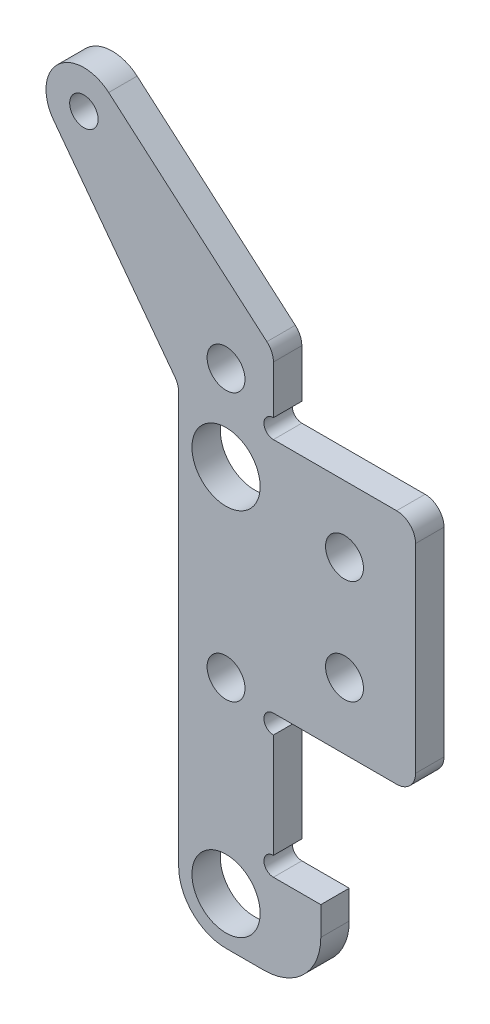
ISO-10303-21;
HEADER;
FILE_DESCRIPTION(('STEP AP214'),'2;1');
FILE_NAME('part.step','',(''),(''),'','','');
FILE_SCHEMA(('AUTOMOTIVE_DESIGN { 1 0 10303 214 1 1 1 1 }'));
ENDSEC;
DATA;
#1=APPLICATION_CONTEXT('core data for automotive mechanical design processes');
#2=APPLICATION_PROTOCOL_DEFINITION('international standard','automotive_design',2000,#1);
#3=PRODUCT_CONTEXT('',#1,'mechanical');
#4=PRODUCT('Part','Part','',(#3));
#5=PRODUCT_RELATED_PRODUCT_CATEGORY('part','',(#4));
#6=PRODUCT_DEFINITION_FORMATION('','',#4);
#7=PRODUCT_DEFINITION_CONTEXT('part definition',#1,'design');
#8=PRODUCT_DEFINITION('design','',#6,#7);
#9=PRODUCT_DEFINITION_SHAPE('','',#8);
#10=(LENGTH_UNIT() NAMED_UNIT(*) SI_UNIT(.MILLI.,.METRE.));
#11=(NAMED_UNIT(*) PLANE_ANGLE_UNIT() SI_UNIT($,.RADIAN.));
#12=(NAMED_UNIT(*) SI_UNIT($,.STERADIAN.) SOLID_ANGLE_UNIT());
#13=UNCERTAINTY_MEASURE_WITH_UNIT(LENGTH_MEASURE(1.E-05),#10,'distance_accuracy_value','');
#14=(GEOMETRIC_REPRESENTATION_CONTEXT(3) GLOBAL_UNCERTAINTY_ASSIGNED_CONTEXT((#13)) GLOBAL_UNIT_ASSIGNED_CONTEXT((#10,
#11,#12)) REPRESENTATION_CONTEXT('',''));
#15=CARTESIAN_POINT('',(0.,0.,0.));
#16=DIRECTION('',(0.,0.,1.));
#17=DIRECTION('',(1.,0.,0.));
#18=AXIS2_PLACEMENT_3D('',#15,#16,#17);
#19=CARTESIAN_POINT('',(-60.,0.,3.));
#20=DIRECTION('',(0.,0.,1.));
#21=DIRECTION('',(1.,0.,0.));
#22=AXIS2_PLACEMENT_3D('',#19,#20,#21);
#23=PLANE('',#22);
#24=DIRECTION('',(1.,0.,0.));
#25=VECTOR('',#24,1.);
#26=CARTESIAN_POINT('',(-60.,-5.00000000000001,3.));
#27=LINE('',#26,#25);
#28=CARTESIAN_POINT('',(-60.,-5.,3.));
#29=VERTEX_POINT('',#28);
#30=CARTESIAN_POINT('',(-56.,-5.00000000000001,3.));
#31=VERTEX_POINT('',#30);
#32=EDGE_CURVE('E391',#29,#31,#27,.T.);
#33=ORIENTED_EDGE('',*,*,#32,.T.);
#34=CARTESIAN_POINT('',(-56.,0.999999999999995,3.));
#35=DIRECTION('',(0.,0.,1.));
#36=DIRECTION('',(1.,0.,0.));
#37=AXIS2_PLACEMENT_3D('',#34,#35,#36);
#38=CIRCLE('',#37,6.);
#39=CARTESIAN_POINT('',(-50.,0.999999999999995,3.));
#40=VERTEX_POINT('',#39);
#41=EDGE_CURVE('E11',#31,#40,#38,.T.);
#42=ORIENTED_EDGE('',*,*,#41,.T.);
#43=DIRECTION('',(0.,1.,0.));
#44=VECTOR('',#43,1.);
#45=CARTESIAN_POINT('',(-50.,-5.,3.));
#46=LINE('',#45,#44);
#47=CARTESIAN_POINT('',(-50.,3.99999999999976,3.));
#48=VERTEX_POINT('',#47);
#49=EDGE_CURVE('E367',#40,#48,#46,.T.);
#50=ORIENTED_EDGE('',*,*,#49,.T.);
#51=DIRECTION('',(-1.,0.,0.));
#52=VECTOR('',#51,1.);
#53=CARTESIAN_POINT('',(-50.,3.99999999999976,3.));
#54=LINE('',#53,#52);
#55=CARTESIAN_POINT('',(-55.,3.99999999999976,3.));
#56=VERTEX_POINT('',#55);
#57=EDGE_CURVE('E381',#48,#56,#54,.T.);
#58=ORIENTED_EDGE('',*,*,#57,.T.);
#59=CARTESIAN_POINT('',(-55.,4.99999999999976,3.));
#60=DIRECTION('',(0.,0.,1.));
#61=DIRECTION('',(1.,0.,0.));
#62=AXIS2_PLACEMENT_3D('',#59,#60,#61);
#63=CIRCLE('',#62,0.999999999999998);
#64=CARTESIAN_POINT('',(-55.,5.99999999999976,3.));
#65=VERTEX_POINT('',#64);
#66=EDGE_CURVE('E428',#65,#56,#63,.T.);
#67=ORIENTED_EDGE('',*,*,#66,.F.);
#68=DIRECTION('',(0.,1.,0.));
#69=VECTOR('',#68,1.);
#70=CARTESIAN_POINT('',(-55.,18.9999999999998,3.));
#71=LINE('',#70,#69);
#72=CARTESIAN_POINT('',(-55.,16.9999999999998,3.));
#73=VERTEX_POINT('',#72);
#74=EDGE_CURVE('E384',#65,#73,#71,.T.);
#75=ORIENTED_EDGE('',*,*,#74,.T.);
#76=CARTESIAN_POINT('',(-55.,17.9999999999998,3.));
#77=DIRECTION('',(0.,0.,1.));
#78=DIRECTION('',(1.,0.,0.));
#79=AXIS2_PLACEMENT_3D('',#76,#77,#78);
#80=CIRCLE('',#79,0.999999999999998);
#81=CARTESIAN_POINT('',(-55.,18.9999999999998,3.));
#82=VERTEX_POINT('',#81);
#83=EDGE_CURVE('E423',#82,#73,#80,.T.);
#84=ORIENTED_EDGE('',*,*,#83,.F.);
#85=DIRECTION('',(1.,0.,0.));
#86=VECTOR('',#85,1.);
#87=CARTESIAN_POINT('',(-40.0000000000001,18.9999999999998,3.));
#88=LINE('',#87,#86);
#89=CARTESIAN_POINT('',(-42.0000000000001,18.9999999999998,3.));
#90=VERTEX_POINT('',#89);
#91=EDGE_CURVE('E389',#82,#90,#88,.T.);
#92=ORIENTED_EDGE('',*,*,#91,.T.);
#93=CARTESIAN_POINT('',(-42.0000000000001,20.9999999999998,3.));
#94=DIRECTION('',(0.,0.,1.));
#95=DIRECTION('',(1.,0.,0.));
#96=AXIS2_PLACEMENT_3D('',#93,#94,#95);
#97=CIRCLE('',#96,2.);
#98=CARTESIAN_POINT('',(-40.0000000000001,20.9999999999998,3.));
#99=VERTEX_POINT('',#98);
#100=EDGE_CURVE('E330',#90,#99,#97,.T.);
#101=ORIENTED_EDGE('',*,*,#100,.T.);
#102=DIRECTION('',(0.,1.,0.));
#103=VECTOR('',#102,1.);
#104=CARTESIAN_POINT('',(-40.0000000000001,43.9999999999998,3.));
#105=LINE('',#104,#103);
#106=CARTESIAN_POINT('',(-40.0000000000001,41.9999999999998,3.));
#107=VERTEX_POINT('',#106);
#108=EDGE_CURVE('E221',#99,#107,#105,.T.);
#109=ORIENTED_EDGE('',*,*,#108,.T.);
#110=CARTESIAN_POINT('',(-42.0000000000001,41.9999999999998,3.));
#111=DIRECTION('',(0.,0.,1.));
#112=DIRECTION('',(1.,0.,0.));
#113=AXIS2_PLACEMENT_3D('',#110,#111,#112);
#114=CIRCLE('',#113,2.);
#115=CARTESIAN_POINT('',(-42.0000000000001,43.9999999999998,3.));
#116=VERTEX_POINT('',#115);
#117=EDGE_CURVE('E327',#107,#116,#114,.T.);
#118=ORIENTED_EDGE('',*,*,#117,.T.);
#119=DIRECTION('',(-1.,0.,0.));
#120=VECTOR('',#119,1.);
#121=CARTESIAN_POINT('',(-55.,43.9999999999998,3.));
#122=LINE('',#121,#120);
#123=CARTESIAN_POINT('',(-55.,43.9999999999998,3.));
#124=VERTEX_POINT('',#123);
#125=EDGE_CURVE('E207',#116,#124,#122,.T.);
#126=ORIENTED_EDGE('',*,*,#125,.T.);
#127=CARTESIAN_POINT('',(-55.,44.9999999999998,3.));
#128=DIRECTION('',(0.,0.,1.));
#129=DIRECTION('',(1.,0.,0.));
#130=AXIS2_PLACEMENT_3D('',#127,#128,#129);
#131=CIRCLE('',#130,0.999999999999998);
#132=CARTESIAN_POINT('',(-55.,45.9999999999998,3.));
#133=VERTEX_POINT('',#132);
#134=EDGE_CURVE('E189',#133,#124,#131,.T.);
#135=ORIENTED_EDGE('',*,*,#134,.F.);
#136=DIRECTION('',(0.,1.,0.));
#137=VECTOR('',#136,1.);
#138=CARTESIAN_POINT('',(-55.,43.9999999999998,3.));
#139=LINE('',#138,#137);
#140=CARTESIAN_POINT('',(-55.,51.0851457844871,3.));
#141=VERTEX_POINT('',#140);
#142=EDGE_CURVE('E204',#133,#141,#139,.T.);
#143=ORIENTED_EDGE('',*,*,#142,.T.);
#144=CARTESIAN_POINT('',(-57.,51.0851457844871,3.));
#145=DIRECTION('',(0.,0.,1.));
#146=DIRECTION('',(1.,0.,0.));
#147=AXIS2_PLACEMENT_3D('',#144,#145,#146);
#148=CIRCLE('',#147,2.);
#149=CARTESIAN_POINT('',(-55.6921360035521,52.5982524452336,3.));
#150=VERTEX_POINT('',#149);
#151=EDGE_CURVE('E324',#141,#150,#148,.T.);
#152=ORIENTED_EDGE('',*,*,#151,.T.);
#153=DIRECTION('',(-0.756553330373234,0.65393199822395,0.));
#154=VECTOR('',#153,1.);
#155=CARTESIAN_POINT('',(-72.3842720071042,67.0262133214929,3.));
#156=LINE('',#155,#154);
#157=CARTESIAN_POINT('',(-72.3842720071042,67.0262133214929,3.));
#158=VERTEX_POINT('',#157);
#159=EDGE_CURVE('E215',#150,#158,#156,.T.);
#160=ORIENTED_EDGE('',*,*,#159,.T.);
#161=CARTESIAN_POINT('',(-75.,64.,3.));
#162=DIRECTION('',(0.,0.,1.));
#163=DIRECTION('',(1.,0.,0.));
#164=AXIS2_PLACEMENT_3D('',#161,#162,#163);
#165=CIRCLE('',#164,4.);
#166=CARTESIAN_POINT('',(-78.2,61.6,3.));
#167=VERTEX_POINT('',#166);
#168=EDGE_CURVE('E219',#158,#167,#165,.T.);
#169=ORIENTED_EDGE('',*,*,#168,.T.);
#170=DIRECTION('',(0.599999999999995,-0.800000000000004,0.));
#171=VECTOR('',#170,1.);
#172=CARTESIAN_POINT('',(-78.2,61.6,3.));
#173=LINE('',#172,#171);
#174=CARTESIAN_POINT('',(-65.4,44.5333333333331,3.));
#175=VERTEX_POINT('',#174);
#176=EDGE_CURVE('E273',#167,#175,#173,.T.);
#177=ORIENTED_EDGE('',*,*,#176,.T.);
#178=CARTESIAN_POINT('',(-67.,43.3333333333331,3.));
#179=DIRECTION('',(0.,0.,1.));
#180=DIRECTION('',(1.,0.,0.));
#181=AXIS2_PLACEMENT_3D('',#178,#179,#180);
#182=CIRCLE('',#181,2.);
#183=CARTESIAN_POINT('',(-65.,43.3333333333331,3.));
#184=VERTEX_POINT('',#183);
#185=EDGE_CURVE('E353',#175,#184,#182,.F.);
#186=ORIENTED_EDGE('',*,*,#185,.T.);
#187=DIRECTION('',(0.,-1.,0.));
#188=VECTOR('',#187,1.);
#189=CARTESIAN_POINT('',(-65.,0.,3.));
#190=LINE('',#189,#188);
#191=CARTESIAN_POINT('',(-65.,0.,3.));
#192=VERTEX_POINT('',#191);
#193=EDGE_CURVE('E488',#184,#192,#190,.T.);
#194=ORIENTED_EDGE('',*,*,#193,.T.);
#195=CARTESIAN_POINT('',(-60.,0.,3.));
#196=DIRECTION('',(0.,0.,1.));
#197=DIRECTION('',(1.,0.,0.));
#198=AXIS2_PLACEMENT_3D('',#195,#196,#197);
#199=CIRCLE('',#198,4.99999999999999);
#200=EDGE_CURVE('E491',#192,#29,#199,.T.);
#201=ORIENTED_EDGE('',*,*,#200,.T.);
#202=EDGE_LOOP('',(#33,#42,#50,#58,#67,#75,#84,#92,#101,#109,#118,#126,#135,#143,#152,#160,#169,
#177,#186,#194,#201));
#203=FACE_BOUND('',#202,.T.);
#204=CARTESIAN_POINT('',(-47.5000000000001,25.9999999999998,3.));
#205=DIRECTION('',(0.,0.,1.));
#206=DIRECTION('',(1.,0.,0.));
#207=AXIS2_PLACEMENT_3D('',#204,#205,#206);
#208=CIRCLE('',#207,2.);
#209=CARTESIAN_POINT('',(-45.5000000000001,25.9999999999998,3.));
#210=VERTEX_POINT('',#209);
#211=EDGE_CURVE('E439',#210,#210,#208,.T.);
#212=ORIENTED_EDGE('',*,*,#211,.F.);
#213=EDGE_LOOP('',(#212));
#214=FACE_BOUND('',#213,.T.);
#215=CARTESIAN_POINT('',(-60.,48.,3.));
#216=DIRECTION('',(0.,0.,1.));
#217=DIRECTION('',(1.,0.,0.));
#218=AXIS2_PLACEMENT_3D('',#215,#216,#217);
#219=CIRCLE('',#218,2.);
#220=CARTESIAN_POINT('',(-58.,48.,3.));
#221=VERTEX_POINT('',#220);
#222=EDGE_CURVE('E455',#221,#221,#219,.T.);
#223=ORIENTED_EDGE('',*,*,#222,.F.);
#224=EDGE_LOOP('',(#223));
#225=FACE_BOUND('',#224,.T.);
#226=CARTESIAN_POINT('',(-75.,64.,3.));
#227=DIRECTION('',(0.,0.,1.));
#228=DIRECTION('',(1.,0.,0.));
#229=AXIS2_PLACEMENT_3D('',#226,#227,#228);
#230=CIRCLE('',#229,1.5);
#231=CARTESIAN_POINT('',(-73.5,64.,3.));
#232=VERTEX_POINT('',#231);
#233=EDGE_CURVE('E471',#232,#232,#230,.T.);
#234=ORIENTED_EDGE('',*,*,#233,.F.);
#235=EDGE_LOOP('',(#234));
#236=FACE_BOUND('',#235,.T.);
#237=CARTESIAN_POINT('',(-60.,0.,3.));
#238=DIRECTION('',(0.,0.,1.));
#239=DIRECTION('',(1.,0.,0.));
#240=AXIS2_PLACEMENT_3D('',#237,#238,#239);
#241=CIRCLE('',#240,3.6);
#242=CARTESIAN_POINT('',(-56.4,0.,3.));
#243=VERTEX_POINT('',#242);
#244=EDGE_CURVE('E233',#243,#243,#241,.T.);
#245=ORIENTED_EDGE('',*,*,#244,.F.);
#246=EDGE_LOOP('',(#245));
#247=FACE_BOUND('',#246,.T.);
#248=CARTESIAN_POINT('',(-60.,39.,3.));
#249=DIRECTION('',(0.,0.,1.));
#250=DIRECTION('',(1.,0.,0.));
#251=AXIS2_PLACEMENT_3D('',#248,#249,#250);
#252=CIRCLE('',#251,3.6);
#253=CARTESIAN_POINT('',(-56.4,39.,3.));
#254=VERTEX_POINT('',#253);
#255=EDGE_CURVE('E463',#254,#254,#252,.T.);
#256=ORIENTED_EDGE('',*,*,#255,.F.);
#257=EDGE_LOOP('',(#256));
#258=FACE_BOUND('',#257,.T.);
#259=CARTESIAN_POINT('',(-60.,19.75,3.));
#260=DIRECTION('',(0.,0.,1.));
#261=DIRECTION('',(1.,0.,0.));
#262=AXIS2_PLACEMENT_3D('',#259,#260,#261);
#263=CIRCLE('',#262,2.);
#264=CARTESIAN_POINT('',(-58.,19.75,3.));
#265=VERTEX_POINT('',#264);
#266=EDGE_CURVE('E447',#265,#265,#263,.T.);
#267=ORIENTED_EDGE('',*,*,#266,.F.);
#268=EDGE_LOOP('',(#267));
#269=FACE_BOUND('',#268,.T.);
#270=CARTESIAN_POINT('',(-47.5000000000001,36.9999999999998,3.));
#271=DIRECTION('',(0.,0.,1.));
#272=DIRECTION('',(1.,0.,0.));
#273=AXIS2_PLACEMENT_3D('',#270,#271,#272);
#274=CIRCLE('',#273,2.);
#275=CARTESIAN_POINT('',(-45.5000000000001,36.9999999999998,3.));
#276=VERTEX_POINT('',#275);
#277=EDGE_CURVE('E431',#276,#276,#274,.T.);
#278=ORIENTED_EDGE('',*,*,#277,.F.);
#279=EDGE_LOOP('',(#278));
#280=FACE_BOUND('',#279,.T.);
#281=ADVANCED_FACE('F41',(#203,#214,#225,#236,#247,#258,#269,#280),#23,.T.);
#282=CARTESIAN_POINT('',(-60.,0.,0.));
#283=DIRECTION('',(0.,0.,1.));
#284=DIRECTION('',(1.,0.,0.));
#285=AXIS2_PLACEMENT_3D('',#282,#283,#284);
#286=PLANE('',#285);
#287=DIRECTION('',(0.,1.,0.));
#288=VECTOR('',#287,1.);
#289=CARTESIAN_POINT('',(-50.,-5.,0.));
#290=LINE('',#289,#288);
#291=CARTESIAN_POINT('',(-50.,0.999999999999995,0.));
#292=VERTEX_POINT('',#291);
#293=CARTESIAN_POINT('',(-50.,3.99999999999976,0.));
#294=VERTEX_POINT('',#293);
#295=EDGE_CURVE('E242',#292,#294,#290,.T.);
#296=ORIENTED_EDGE('',*,*,#295,.F.);
#297=CARTESIAN_POINT('',(-56.,0.999999999999995,0.));
#298=DIRECTION('',(0.,0.,1.));
#299=DIRECTION('',(1.,0.,0.));
#300=AXIS2_PLACEMENT_3D('',#297,#298,#299);
#301=CIRCLE('',#300,6.);
#302=CARTESIAN_POINT('',(-56.,-5.00000000000001,0.));
#303=VERTEX_POINT('',#302);
#304=EDGE_CURVE('E64',#292,#303,#301,.F.);
#305=ORIENTED_EDGE('',*,*,#304,.T.);
#306=DIRECTION('',(1.,0.,0.));
#307=VECTOR('',#306,1.);
#308=CARTESIAN_POINT('',(-60.,-5.00000000000001,0.));
#309=LINE('',#308,#307);
#310=CARTESIAN_POINT('',(-60.,-5.,0.));
#311=VERTEX_POINT('',#310);
#312=EDGE_CURVE('E239',#311,#303,#309,.T.);
#313=ORIENTED_EDGE('',*,*,#312,.F.);
#314=CARTESIAN_POINT('',(-60.,0.,0.));
#315=DIRECTION('',(0.,0.,1.));
#316=DIRECTION('',(1.,0.,0.));
#317=AXIS2_PLACEMENT_3D('',#314,#315,#316);
#318=CIRCLE('',#317,4.99999999999999);
#319=CARTESIAN_POINT('',(-65.,0.,0.));
#320=VERTEX_POINT('',#319);
#321=EDGE_CURVE('E236',#320,#311,#318,.T.);
#322=ORIENTED_EDGE('',*,*,#321,.F.);
#323=DIRECTION('',(0.,-1.,0.));
#324=VECTOR('',#323,1.);
#325=CARTESIAN_POINT('',(-65.,0.,0.));
#326=LINE('',#325,#324);
#327=CARTESIAN_POINT('',(-65.,43.3333333333331,0.));
#328=VERTEX_POINT('',#327);
#329=EDGE_CURVE('E232',#328,#320,#326,.T.);
#330=ORIENTED_EDGE('',*,*,#329,.F.);
#331=CARTESIAN_POINT('',(-67.,43.3333333333331,0.));
#332=DIRECTION('',(0.,0.,1.));
#333=DIRECTION('',(1.,0.,0.));
#334=AXIS2_PLACEMENT_3D('',#331,#332,#333);
#335=CIRCLE('',#334,2.);
#336=CARTESIAN_POINT('',(-65.4,44.5333333333331,0.));
#337=VERTEX_POINT('',#336);
#338=EDGE_CURVE('E350',#328,#337,#335,.T.);
#339=ORIENTED_EDGE('',*,*,#338,.T.);
#340=DIRECTION('',(0.599999999999995,-0.800000000000004,0.));
#341=VECTOR('',#340,1.);
#342=CARTESIAN_POINT('',(-78.2,61.6,0.));
#343=LINE('',#342,#341);
#344=CARTESIAN_POINT('',(-78.2,61.6,0.));
#345=VERTEX_POINT('',#344);
#346=EDGE_CURVE('E228',#345,#337,#343,.T.);
#347=ORIENTED_EDGE('',*,*,#346,.F.);
#348=CARTESIAN_POINT('',(-75.,64.,0.));
#349=DIRECTION('',(0.,0.,1.));
#350=DIRECTION('',(1.,0.,0.));
#351=AXIS2_PLACEMENT_3D('',#348,#349,#350);
#352=CIRCLE('',#351,4.);
#353=CARTESIAN_POINT('',(-72.3842720071042,67.0262133214929,0.));
#354=VERTEX_POINT('',#353);
#355=EDGE_CURVE('E270',#354,#345,#352,.T.);
#356=ORIENTED_EDGE('',*,*,#355,.F.);
#357=DIRECTION('',(-0.756553330373234,0.65393199822395,0.));
#358=VECTOR('',#357,1.);
#359=CARTESIAN_POINT('',(-72.3842720071042,67.0262133214929,0.));
#360=LINE('',#359,#358);
#361=CARTESIAN_POINT('',(-55.6921360035521,52.5982524452336,0.));
#362=VERTEX_POINT('',#361);
#363=EDGE_CURVE('E267',#362,#354,#360,.T.);
#364=ORIENTED_EDGE('',*,*,#363,.F.);
#365=CARTESIAN_POINT('',(-57.,51.0851457844871,0.));
#366=DIRECTION('',(0.,0.,1.));
#367=DIRECTION('',(1.,0.,0.));
#368=AXIS2_PLACEMENT_3D('',#365,#366,#367);
#369=CIRCLE('',#368,2.);
#370=CARTESIAN_POINT('',(-55.,51.0851457844871,0.));
#371=VERTEX_POINT('',#370);
#372=EDGE_CURVE('E312',#362,#371,#369,.F.);
#373=ORIENTED_EDGE('',*,*,#372,.T.);
#374=DIRECTION('',(0.,1.,0.));
#375=VECTOR('',#374,1.);
#376=CARTESIAN_POINT('',(-55.,43.9999999999998,0.));
#377=LINE('',#376,#375);
#378=CARTESIAN_POINT('',(-55.,45.9999999999998,0.));
#379=VERTEX_POINT('',#378);
#380=EDGE_CURVE('E264',#379,#371,#377,.T.);
#381=ORIENTED_EDGE('',*,*,#380,.F.);
#382=CARTESIAN_POINT('',(-55.,44.9999999999998,0.));
#383=DIRECTION('',(0.,0.,1.));
#384=DIRECTION('',(1.,0.,0.));
#385=AXIS2_PLACEMENT_3D('',#382,#383,#384);
#386=CIRCLE('',#385,0.999999999999998);
#387=CARTESIAN_POINT('',(-55.,43.9999999999998,0.));
#388=VERTEX_POINT('',#387);
#389=EDGE_CURVE('E192',#379,#388,#386,.T.);
#390=ORIENTED_EDGE('',*,*,#389,.T.);
#391=DIRECTION('',(-1.,0.,0.));
#392=VECTOR('',#391,1.);
#393=CARTESIAN_POINT('',(-55.,43.9999999999998,0.));
#394=LINE('',#393,#392);
#395=CARTESIAN_POINT('',(-42.0000000000001,43.9999999999998,0.));
#396=VERTEX_POINT('',#395);
#397=EDGE_CURVE('E261',#396,#388,#394,.T.);
#398=ORIENTED_EDGE('',*,*,#397,.F.);
#399=CARTESIAN_POINT('',(-42.0000000000001,41.9999999999998,0.));
#400=DIRECTION('',(0.,0.,1.));
#401=DIRECTION('',(1.,0.,0.));
#402=AXIS2_PLACEMENT_3D('',#399,#400,#401);
#403=CIRCLE('',#402,2.);
#404=CARTESIAN_POINT('',(-40.0000000000001,41.9999999999998,0.));
#405=VERTEX_POINT('',#404);
#406=EDGE_CURVE('E315',#396,#405,#403,.F.);
#407=ORIENTED_EDGE('',*,*,#406,.T.);
#408=DIRECTION('',(0.,1.,0.));
#409=VECTOR('',#408,1.);
#410=CARTESIAN_POINT('',(-40.0000000000001,43.9999999999998,0.));
#411=LINE('',#410,#409);
#412=CARTESIAN_POINT('',(-40.0000000000001,20.9999999999998,0.));
#413=VERTEX_POINT('',#412);
#414=EDGE_CURVE('E257',#413,#405,#411,.T.);
#415=ORIENTED_EDGE('',*,*,#414,.F.);
#416=CARTESIAN_POINT('',(-42.0000000000001,20.9999999999998,0.));
#417=DIRECTION('',(0.,0.,1.));
#418=DIRECTION('',(1.,0.,0.));
#419=AXIS2_PLACEMENT_3D('',#416,#417,#418);
#420=CIRCLE('',#419,2.);
#421=CARTESIAN_POINT('',(-42.0000000000001,18.9999999999998,0.));
#422=VERTEX_POINT('',#421);
#423=EDGE_CURVE('E318',#413,#422,#420,.F.);
#424=ORIENTED_EDGE('',*,*,#423,.T.);
#425=DIRECTION('',(1.,0.,0.));
#426=VECTOR('',#425,1.);
#427=CARTESIAN_POINT('',(-40.0000000000001,18.9999999999998,0.));
#428=LINE('',#427,#426);
#429=CARTESIAN_POINT('',(-55.,18.9999999999998,0.));
#430=VERTEX_POINT('',#429);
#431=EDGE_CURVE('E253',#430,#422,#428,.T.);
#432=ORIENTED_EDGE('',*,*,#431,.F.);
#433=CARTESIAN_POINT('',(-55.,17.9999999999998,0.));
#434=DIRECTION('',(0.,0.,1.));
#435=DIRECTION('',(1.,0.,0.));
#436=AXIS2_PLACEMENT_3D('',#433,#434,#435);
#437=CIRCLE('',#436,0.999999999999998);
#438=CARTESIAN_POINT('',(-55.,16.9999999999998,0.));
#439=VERTEX_POINT('',#438);
#440=EDGE_CURVE('E209',#430,#439,#437,.T.);
#441=ORIENTED_EDGE('',*,*,#440,.T.);
#442=DIRECTION('',(0.,1.,0.));
#443=VECTOR('',#442,1.);
#444=CARTESIAN_POINT('',(-55.,18.9999999999998,0.));
#445=LINE('',#444,#443);
#446=CARTESIAN_POINT('',(-55.,5.99999999999976,0.));
#447=VERTEX_POINT('',#446);
#448=EDGE_CURVE('E249',#447,#439,#445,.T.);
#449=ORIENTED_EDGE('',*,*,#448,.F.);
#450=CARTESIAN_POINT('',(-55.,4.99999999999976,0.));
#451=DIRECTION('',(0.,0.,1.));
#452=DIRECTION('',(1.,0.,0.));
#453=AXIS2_PLACEMENT_3D('',#450,#451,#452);
#454=CIRCLE('',#453,0.999999999999998);
#455=CARTESIAN_POINT('',(-55.,3.99999999999976,0.));
#456=VERTEX_POINT('',#455);
#457=EDGE_CURVE('E375',#447,#456,#454,.T.);
#458=ORIENTED_EDGE('',*,*,#457,.T.);
#459=DIRECTION('',(-1.,0.,0.));
#460=VECTOR('',#459,1.);
#461=CARTESIAN_POINT('',(-50.,3.99999999999976,0.));
#462=LINE('',#461,#460);
#463=EDGE_CURVE('E245',#294,#456,#462,.T.);
#464=ORIENTED_EDGE('',*,*,#463,.F.);
#465=EDGE_LOOP('',(#296,#305,#313,#322,#330,#339,#347,#356,#364,#373,#381,#390,#398,#407,#415,
#424,#432,#441,#449,#458,#464));
#466=FACE_BOUND('',#465,.T.);
#467=CARTESIAN_POINT('',(-60.,0.,0.));
#468=DIRECTION('',(0.,0.,1.));
#469=DIRECTION('',(1.,0.,0.));
#470=AXIS2_PLACEMENT_3D('',#467,#468,#469);
#471=CIRCLE('',#470,3.6);
#472=CARTESIAN_POINT('',(-56.4,0.,0.));
#473=VERTEX_POINT('',#472);
#474=EDGE_CURVE('E475',#473,#473,#471,.T.);
#475=ORIENTED_EDGE('',*,*,#474,.T.);
#476=EDGE_LOOP('',(#475));
#477=FACE_BOUND('',#476,.T.);
#478=CARTESIAN_POINT('',(-75.,64.,0.));
#479=DIRECTION('',(0.,0.,1.));
#480=DIRECTION('',(1.,0.,0.));
#481=AXIS2_PLACEMENT_3D('',#478,#479,#480);
#482=CIRCLE('',#481,1.5);
#483=CARTESIAN_POINT('',(-73.5,64.,0.));
#484=VERTEX_POINT('',#483);
#485=EDGE_CURVE('E467',#484,#484,#482,.T.);
#486=ORIENTED_EDGE('',*,*,#485,.T.);
#487=EDGE_LOOP('',(#486));
#488=FACE_BOUND('',#487,.T.);
#489=CARTESIAN_POINT('',(-60.,39.,0.));
#490=DIRECTION('',(0.,0.,1.));
#491=DIRECTION('',(1.,0.,0.));
#492=AXIS2_PLACEMENT_3D('',#489,#490,#491);
#493=CIRCLE('',#492,3.6);
#494=CARTESIAN_POINT('',(-56.4,39.,0.));
#495=VERTEX_POINT('',#494);
#496=EDGE_CURVE('E459',#495,#495,#493,.T.);
#497=ORIENTED_EDGE('',*,*,#496,.T.);
#498=EDGE_LOOP('',(#497));
#499=FACE_BOUND('',#498,.T.);
#500=CARTESIAN_POINT('',(-60.,48.,0.));
#501=DIRECTION('',(0.,0.,1.));
#502=DIRECTION('',(1.,0.,0.));
#503=AXIS2_PLACEMENT_3D('',#500,#501,#502);
#504=CIRCLE('',#503,2.);
#505=CARTESIAN_POINT('',(-58.,48.,0.));
#506=VERTEX_POINT('',#505);
#507=EDGE_CURVE('E451',#506,#506,#504,.T.);
#508=ORIENTED_EDGE('',*,*,#507,.T.);
#509=EDGE_LOOP('',(#508));
#510=FACE_BOUND('',#509,.T.);
#511=CARTESIAN_POINT('',(-60.,19.75,0.));
#512=DIRECTION('',(0.,0.,1.));
#513=DIRECTION('',(1.,0.,0.));
#514=AXIS2_PLACEMENT_3D('',#511,#512,#513);
#515=CIRCLE('',#514,2.);
#516=CARTESIAN_POINT('',(-58.,19.75,0.));
#517=VERTEX_POINT('',#516);
#518=EDGE_CURVE('E443',#517,#517,#515,.T.);
#519=ORIENTED_EDGE('',*,*,#518,.T.);
#520=EDGE_LOOP('',(#519));
#521=FACE_BOUND('',#520,.T.);
#522=CARTESIAN_POINT('',(-47.5000000000001,25.9999999999998,0.));
#523=DIRECTION('',(0.,0.,1.));
#524=DIRECTION('',(1.,0.,0.));
#525=AXIS2_PLACEMENT_3D('',#522,#523,#524);
#526=CIRCLE('',#525,2.);
#527=CARTESIAN_POINT('',(-45.5000000000001,25.9999999999998,0.));
#528=VERTEX_POINT('',#527);
#529=EDGE_CURVE('E435',#528,#528,#526,.T.);
#530=ORIENTED_EDGE('',*,*,#529,.T.);
#531=EDGE_LOOP('',(#530));
#532=FACE_BOUND('',#531,.T.);
#533=CARTESIAN_POINT('',(-47.5000000000001,36.9999999999998,0.));
#534=DIRECTION('',(0.,0.,1.));
#535=DIRECTION('',(1.,0.,0.));
#536=AXIS2_PLACEMENT_3D('',#533,#534,#535);
#537=CIRCLE('',#536,2.);
#538=CARTESIAN_POINT('',(-45.5000000000001,36.9999999999998,0.));
#539=VERTEX_POINT('',#538);
#540=EDGE_CURVE('E417',#539,#539,#537,.T.);
#541=ORIENTED_EDGE('',*,*,#540,.T.);
#542=EDGE_LOOP('',(#541));
#543=FACE_BOUND('',#542,.T.);
#544=ADVANCED_FACE('F371',(#466,#477,#488,#499,#510,#521,#532,#543),#286,.F.);
#545=CARTESIAN_POINT('',(-78.2,61.6,3.));
#546=DIRECTION('',(0.800000000000004,0.599999999999995,0.));
#547=DIRECTION('',(-0.599999999999995,0.800000000000004,0.));
#548=AXIS2_PLACEMENT_3D('',#545,#546,#547);
#549=PLANE('',#548);
#550=ORIENTED_EDGE('',*,*,#346,.T.);
#551=DIRECTION('',(0.,0.,-1.));
#552=VECTOR('',#551,1.);
#553=CARTESIAN_POINT('',(-65.4,44.5333333333331,3.));
#554=LINE('',#553,#552);
#555=EDGE_CURVE('E347',#337,#175,#554,.F.);
#556=ORIENTED_EDGE('',*,*,#555,.T.);
#557=ORIENTED_EDGE('',*,*,#176,.F.);
#558=DIRECTION('',(0.,0.,-1.));
#559=VECTOR('',#558,1.);
#560=CARTESIAN_POINT('',(-78.2,61.6,3.));
#561=LINE('',#560,#559);
#562=EDGE_CURVE('E227',#167,#345,#561,.T.);
#563=ORIENTED_EDGE('',*,*,#562,.T.);
#564=EDGE_LOOP('',(#550,#556,#557,#563));
#565=FACE_BOUND('',#564,.T.);
#566=ADVANCED_FACE('F508',(#565),#549,.F.);
#567=CARTESIAN_POINT('',(-65.,0.,3.));
#568=DIRECTION('',(1.,0.,0.));
#569=DIRECTION('',(0.,1.,0.));
#570=AXIS2_PLACEMENT_3D('',#567,#568,#569);
#571=PLANE('',#570);
#572=ORIENTED_EDGE('',*,*,#193,.F.);
#573=DIRECTION('',(0.,0.,-1.));
#574=VECTOR('',#573,1.);
#575=CARTESIAN_POINT('',(-65.,43.3333333333331,0.));
#576=LINE('',#575,#574);
#577=EDGE_CURVE('E343',#184,#328,#576,.T.);
#578=ORIENTED_EDGE('',*,*,#577,.T.);
#579=ORIENTED_EDGE('',*,*,#329,.T.);
#580=DIRECTION('',(0.,0.,-1.));
#581=VECTOR('',#580,1.);
#582=CARTESIAN_POINT('',(-65.,0.,3.));
#583=LINE('',#582,#581);
#584=EDGE_CURVE('E199',#192,#320,#583,.T.);
#585=ORIENTED_EDGE('',*,*,#584,.F.);
#586=EDGE_LOOP('',(#572,#578,#579,#585));
#587=FACE_BOUND('',#586,.T.);
#588=ADVANCED_FACE('F547',(#587),#571,.F.);
#589=CARTESIAN_POINT('',(-60.,0.,3.));
#590=DIRECTION('',(0.,0.,-1.));
#591=DIRECTION('',(-1.,0.,0.));
#592=AXIS2_PLACEMENT_3D('',#589,#590,#591);
#593=CYLINDRICAL_SURFACE('',#592,4.99999999999999);
#594=ORIENTED_EDGE('',*,*,#321,.T.);
#595=DIRECTION('',(0.,0.,-1.));
#596=VECTOR('',#595,1.);
#597=CARTESIAN_POINT('',(-60.,-5.,3.));
#598=LINE('',#597,#596);
#599=EDGE_CURVE('E295',#29,#311,#598,.T.);
#600=ORIENTED_EDGE('',*,*,#599,.F.);
#601=ORIENTED_EDGE('',*,*,#200,.F.);
#602=ORIENTED_EDGE('',*,*,#584,.T.);
#603=EDGE_LOOP('',(#594,#600,#601,#602));
#604=FACE_BOUND('',#603,.T.);
#605=ADVANCED_FACE('F544',(#604),#593,.T.);
#606=CARTESIAN_POINT('',(-60.,-5.00000000000001,3.));
#607=DIRECTION('',(0.,1.,0.));
#608=DIRECTION('',(-1.,0.,0.));
#609=AXIS2_PLACEMENT_3D('',#606,#607,#608);
#610=PLANE('',#609);
#611=ORIENTED_EDGE('',*,*,#312,.T.);
#612=DIRECTION('',(0.,0.,-1.));
#613=VECTOR('',#612,1.);
#614=CARTESIAN_POINT('',(-56.,-5.00000000000001,3.));
#615=LINE('',#614,#613);
#616=EDGE_CURVE('E50',#303,#31,#615,.F.);
#617=ORIENTED_EDGE('',*,*,#616,.T.);
#618=ORIENTED_EDGE('',*,*,#32,.F.);
#619=ORIENTED_EDGE('',*,*,#599,.T.);
#620=EDGE_LOOP('',(#611,#617,#618,#619));
#621=FACE_BOUND('',#620,.T.);
#622=ADVANCED_FACE('F541',(#621),#610,.F.);
#623=CARTESIAN_POINT('',(-50.,-5.,3.));
#624=DIRECTION('',(-1.,0.,0.));
#625=DIRECTION('',(0.,0.,1.));
#626=AXIS2_PLACEMENT_3D('',#623,#624,#625);
#627=PLANE('',#626);
#628=ORIENTED_EDGE('',*,*,#49,.F.);
#629=DIRECTION('',(0.,0.,-1.));
#630=VECTOR('',#629,1.);
#631=CARTESIAN_POINT('',(-50.,0.999999999999995,3.));
#632=LINE('',#631,#630);
#633=EDGE_CURVE('E356',#40,#292,#632,.T.);
#634=ORIENTED_EDGE('',*,*,#633,.T.);
#635=ORIENTED_EDGE('',*,*,#295,.T.);
#636=DIRECTION('',(0.,0.,-1.));
#637=VECTOR('',#636,1.);
#638=CARTESIAN_POINT('',(-50.,3.99999999999976,3.));
#639=LINE('',#638,#637);
#640=EDGE_CURVE('E291',#48,#294,#639,.T.);
#641=ORIENTED_EDGE('',*,*,#640,.F.);
#642=EDGE_LOOP('',(#628,#634,#635,#641));
#643=FACE_BOUND('',#642,.T.);
#644=ADVANCED_FACE('F365',(#643),#627,.F.);
#645=CARTESIAN_POINT('',(-50.,3.99999999999976,3.));
#646=DIRECTION('',(0.,-1.,0.));
#647=DIRECTION('',(1.,0.,0.));
#648=AXIS2_PLACEMENT_3D('',#645,#646,#647);
#649=PLANE('',#648);
#650=ORIENTED_EDGE('',*,*,#463,.T.);
#651=DIRECTION('',(0.,0.,-1.));
#652=VECTOR('',#651,1.);
#653=CARTESIAN_POINT('',(-55.,3.99999999999976,3.));
#654=LINE('',#653,#652);
#655=EDGE_CURVE('E288',#56,#456,#654,.T.);
#656=ORIENTED_EDGE('',*,*,#655,.F.);
#657=ORIENTED_EDGE('',*,*,#57,.F.);
#658=ORIENTED_EDGE('',*,*,#640,.T.);
#659=EDGE_LOOP('',(#650,#656,#657,#658));
#660=FACE_BOUND('',#659,.T.);
#661=ADVANCED_FACE('F378',(#660),#649,.F.);
#662=CARTESIAN_POINT('',(-55.,18.9999999999998,3.));
#663=DIRECTION('',(-1.,0.,0.));
#664=DIRECTION('',(0.,0.,1.));
#665=AXIS2_PLACEMENT_3D('',#662,#663,#664);
#666=PLANE('',#665);
#667=ORIENTED_EDGE('',*,*,#448,.T.);
#668=DIRECTION('',(0.,0.,1.));
#669=VECTOR('',#668,1.);
#670=CARTESIAN_POINT('',(-55.,16.9999999999998,0.));
#671=LINE('',#670,#669);
#672=EDGE_CURVE('E413',#439,#73,#671,.T.);
#673=ORIENTED_EDGE('',*,*,#672,.T.);
#674=ORIENTED_EDGE('',*,*,#74,.F.);
#675=DIRECTION('',(0.,0.,1.));
#676=VECTOR('',#675,1.);
#677=CARTESIAN_POINT('',(-55.,5.99999999999976,0.));
#678=LINE('',#677,#676);
#679=EDGE_CURVE('E198',#65,#447,#678,.F.);
#680=ORIENTED_EDGE('',*,*,#679,.T.);
#681=EDGE_LOOP('',(#667,#673,#674,#680));
#682=FACE_BOUND('',#681,.T.);
#683=ADVANCED_FACE('F532',(#682),#666,.F.);
#684=CARTESIAN_POINT('',(-40.0000000000001,18.9999999999998,3.));
#685=DIRECTION('',(0.,1.,0.));
#686=DIRECTION('',(-1.,0.,0.));
#687=AXIS2_PLACEMENT_3D('',#684,#685,#686);
#688=PLANE('',#687);
#689=ORIENTED_EDGE('',*,*,#431,.T.);
#690=DIRECTION('',(0.,0.,-1.));
#691=VECTOR('',#690,1.);
#692=CARTESIAN_POINT('',(-42.0000000000001,18.9999999999998,3.));
#693=LINE('',#692,#691);
#694=EDGE_CURVE('E321',#422,#90,#693,.F.);
#695=ORIENTED_EDGE('',*,*,#694,.T.);
#696=ORIENTED_EDGE('',*,*,#91,.F.);
#697=DIRECTION('',(0.,0.,-1.));
#698=VECTOR('',#697,1.);
#699=CARTESIAN_POINT('',(-55.,18.9999999999998,3.));
#700=LINE('',#699,#698);
#701=EDGE_CURVE('E284',#82,#430,#700,.T.);
#702=ORIENTED_EDGE('',*,*,#701,.T.);
#703=EDGE_LOOP('',(#689,#695,#696,#702));
#704=FACE_BOUND('',#703,.T.);
#705=ADVANCED_FACE('F529',(#704),#688,.F.);
#706=CARTESIAN_POINT('',(-40.0000000000001,43.9999999999998,3.));
#707=DIRECTION('',(-1.,0.,0.));
#708=DIRECTION('',(0.,-1.,0.));
#709=AXIS2_PLACEMENT_3D('',#706,#707,#708);
#710=PLANE('',#709);
#711=ORIENTED_EDGE('',*,*,#108,.F.);
#712=DIRECTION('',(0.,0.,-1.));
#713=VECTOR('',#712,1.);
#714=CARTESIAN_POINT('',(-40.0000000000001,20.9999999999998,3.));
#715=LINE('',#714,#713);
#716=EDGE_CURVE('E308',#99,#413,#715,.T.);
#717=ORIENTED_EDGE('',*,*,#716,.T.);
#718=ORIENTED_EDGE('',*,*,#414,.T.);
#719=DIRECTION('',(0.,0.,-1.));
#720=VECTOR('',#719,1.);
#721=CARTESIAN_POINT('',(-40.0000000000001,41.9999999999998,3.));
#722=LINE('',#721,#720);
#723=EDGE_CURVE('E305',#405,#107,#722,.F.);
#724=ORIENTED_EDGE('',*,*,#723,.T.);
#725=EDGE_LOOP('',(#711,#717,#718,#724));
#726=FACE_BOUND('',#725,.T.);
#727=ADVANCED_FACE('F526',(#726),#710,.F.);
#728=CARTESIAN_POINT('',(-55.,43.9999999999998,3.));
#729=DIRECTION('',(0.,-1.,0.));
#730=DIRECTION('',(0.,0.,-1.));
#731=AXIS2_PLACEMENT_3D('',#728,#729,#730);
#732=PLANE('',#731);
#733=ORIENTED_EDGE('',*,*,#125,.F.);
#734=DIRECTION('',(0.,0.,-1.));
#735=VECTOR('',#734,1.);
#736=CARTESIAN_POINT('',(-42.0000000000001,43.9999999999998,3.));
#737=LINE('',#736,#735);
#738=EDGE_CURVE('E333',#116,#396,#737,.T.);
#739=ORIENTED_EDGE('',*,*,#738,.T.);
#740=ORIENTED_EDGE('',*,*,#397,.T.);
#741=DIRECTION('',(0.,0.,-1.));
#742=VECTOR('',#741,1.);
#743=CARTESIAN_POINT('',(-55.,43.9999999999998,3.));
#744=LINE('',#743,#742);
#745=EDGE_CURVE('E281',#124,#388,#744,.T.);
#746=ORIENTED_EDGE('',*,*,#745,.F.);
#747=EDGE_LOOP('',(#733,#739,#740,#746));
#748=FACE_BOUND('',#747,.T.);
#749=ADVANCED_FACE('F410',(#748),#732,.F.);
#750=CARTESIAN_POINT('',(-55.,43.9999999999998,3.));
#751=DIRECTION('',(-1.,0.,0.));
#752=DIRECTION('',(0.,-1.,0.));
#753=AXIS2_PLACEMENT_3D('',#750,#751,#752);
#754=PLANE('',#753);
#755=ORIENTED_EDGE('',*,*,#380,.T.);
#756=DIRECTION('',(0.,0.,-1.));
#757=VECTOR('',#756,1.);
#758=CARTESIAN_POINT('',(-55.,51.0851457844871,3.));
#759=LINE('',#758,#757);
#760=EDGE_CURVE('E213',#371,#141,#759,.F.);
#761=ORIENTED_EDGE('',*,*,#760,.T.);
#762=ORIENTED_EDGE('',*,*,#142,.F.);
#763=DIRECTION('',(0.,0.,1.));
#764=VECTOR('',#763,1.);
#765=CARTESIAN_POINT('',(-55.,45.9999999999998,0.));
#766=LINE('',#765,#764);
#767=EDGE_CURVE('E185',#133,#379,#766,.F.);
#768=ORIENTED_EDGE('',*,*,#767,.T.);
#769=EDGE_LOOP('',(#755,#761,#762,#768));
#770=FACE_BOUND('',#769,.T.);
#771=ADVANCED_FACE('F211',(#770),#754,.F.);
#772=CARTESIAN_POINT('',(-72.3842720071042,67.0262133214929,3.));
#773=DIRECTION('',(-0.65393199822395,-0.756553330373234,0.));
#774=DIRECTION('',(0.756553330373234,-0.65393199822395,0.));
#775=AXIS2_PLACEMENT_3D('',#772,#773,#774);
#776=PLANE('',#775);
#777=ORIENTED_EDGE('',*,*,#159,.F.);
#778=DIRECTION('',(0.,0.,-1.));
#779=VECTOR('',#778,1.);
#780=CARTESIAN_POINT('',(-55.6921360035521,52.5982524452336,3.));
#781=LINE('',#780,#779);
#782=EDGE_CURVE('E337',#150,#362,#781,.T.);
#783=ORIENTED_EDGE('',*,*,#782,.T.);
#784=ORIENTED_EDGE('',*,*,#363,.T.);
#785=DIRECTION('',(0.,0.,-1.));
#786=VECTOR('',#785,1.);
#787=CARTESIAN_POINT('',(-72.3842720071042,67.0262133214929,3.));
#788=LINE('',#787,#786);
#789=EDGE_CURVE('E277',#158,#354,#788,.T.);
#790=ORIENTED_EDGE('',*,*,#789,.F.);
#791=EDGE_LOOP('',(#777,#783,#784,#790));
#792=FACE_BOUND('',#791,.T.);
#793=ADVANCED_FACE('F517',(#792),#776,.F.);
#794=CARTESIAN_POINT('',(-75.,64.,3.));
#795=DIRECTION('',(0.,0.,-1.));
#796=DIRECTION('',(-1.,0.,0.));
#797=AXIS2_PLACEMENT_3D('',#794,#795,#796);
#798=CYLINDRICAL_SURFACE('',#797,4.);
#799=ORIENTED_EDGE('',*,*,#355,.T.);
#800=ORIENTED_EDGE('',*,*,#562,.F.);
#801=ORIENTED_EDGE('',*,*,#168,.F.);
#802=ORIENTED_EDGE('',*,*,#789,.T.);
#803=EDGE_LOOP('',(#799,#800,#801,#802));
#804=FACE_BOUND('',#803,.T.);
#805=ADVANCED_FACE('F514',(#804),#798,.T.);
#806=CARTESIAN_POINT('',(-60.,0.,3.));
#807=DIRECTION('',(0.,0.,-1.));
#808=DIRECTION('',(-1.,0.,0.));
#809=AXIS2_PLACEMENT_3D('',#806,#807,#808);
#810=CYLINDRICAL_SURFACE('',#809,3.6);
#811=ORIENTED_EDGE('',*,*,#244,.T.);
#812=EDGE_LOOP('',(#811));
#813=FACE_BOUND('',#812,.T.);
#814=ORIENTED_EDGE('',*,*,#474,.F.);
#815=EDGE_LOOP('',(#814));
#816=FACE_BOUND('',#815,.T.);
#817=ADVANCED_FACE('F511',(#813,#816),#810,.F.);
#818=CARTESIAN_POINT('',(-75.,64.,3.));
#819=DIRECTION('',(0.,0.,-1.));
#820=DIRECTION('',(-1.,0.,0.));
#821=AXIS2_PLACEMENT_3D('',#818,#819,#820);
#822=CYLINDRICAL_SURFACE('',#821,1.5);
#823=ORIENTED_EDGE('',*,*,#233,.T.);
#824=EDGE_LOOP('',(#823));
#825=FACE_BOUND('',#824,.T.);
#826=ORIENTED_EDGE('',*,*,#485,.F.);
#827=EDGE_LOOP('',(#826));
#828=FACE_BOUND('',#827,.T.);
#829=ADVANCED_FACE('F661',(#825,#828),#822,.F.);
#830=CARTESIAN_POINT('',(-60.,39.,3.));
#831=DIRECTION('',(0.,0.,-1.));
#832=DIRECTION('',(-1.,0.,0.));
#833=AXIS2_PLACEMENT_3D('',#830,#831,#832);
#834=CYLINDRICAL_SURFACE('',#833,3.6);
#835=ORIENTED_EDGE('',*,*,#255,.T.);
#836=EDGE_LOOP('',(#835));
#837=FACE_BOUND('',#836,.T.);
#838=ORIENTED_EDGE('',*,*,#496,.F.);
#839=EDGE_LOOP('',(#838));
#840=FACE_BOUND('',#839,.T.);
#841=ADVANCED_FACE('F668',(#837,#840),#834,.F.);
#842=CARTESIAN_POINT('',(-60.,48.,3.));
#843=DIRECTION('',(0.,0.,-1.));
#844=DIRECTION('',(-1.,0.,0.));
#845=AXIS2_PLACEMENT_3D('',#842,#843,#844);
#846=CYLINDRICAL_SURFACE('',#845,2.);
#847=ORIENTED_EDGE('',*,*,#222,.T.);
#848=EDGE_LOOP('',(#847));
#849=FACE_BOUND('',#848,.T.);
#850=ORIENTED_EDGE('',*,*,#507,.F.);
#851=EDGE_LOOP('',(#850));
#852=FACE_BOUND('',#851,.T.);
#853=ADVANCED_FACE('F675',(#849,#852),#846,.F.);
#854=CARTESIAN_POINT('',(-60.,19.75,3.));
#855=DIRECTION('',(0.,0.,-1.));
#856=DIRECTION('',(-1.,0.,0.));
#857=AXIS2_PLACEMENT_3D('',#854,#855,#856);
#858=CYLINDRICAL_SURFACE('',#857,2.);
#859=ORIENTED_EDGE('',*,*,#266,.T.);
#860=EDGE_LOOP('',(#859));
#861=FACE_BOUND('',#860,.T.);
#862=ORIENTED_EDGE('',*,*,#518,.F.);
#863=EDGE_LOOP('',(#862));
#864=FACE_BOUND('',#863,.T.);
#865=ADVANCED_FACE('F683',(#861,#864),#858,.F.);
#866=CARTESIAN_POINT('',(-47.5000000000001,25.9999999999998,3.));
#867=DIRECTION('',(0.,0.,-1.));
#868=DIRECTION('',(-1.,0.,0.));
#869=AXIS2_PLACEMENT_3D('',#866,#867,#868);
#870=CYLINDRICAL_SURFACE('',#869,2.);
#871=ORIENTED_EDGE('',*,*,#211,.T.);
#872=EDGE_LOOP('',(#871));
#873=FACE_BOUND('',#872,.T.);
#874=ORIENTED_EDGE('',*,*,#529,.F.);
#875=EDGE_LOOP('',(#874));
#876=FACE_BOUND('',#875,.T.);
#877=ADVANCED_FACE('F691',(#873,#876),#870,.F.);
#878=CARTESIAN_POINT('',(-47.5000000000001,36.9999999999998,3.));
#879=DIRECTION('',(0.,0.,-1.));
#880=DIRECTION('',(-1.,0.,0.));
#881=AXIS2_PLACEMENT_3D('',#878,#879,#880);
#882=CYLINDRICAL_SURFACE('',#881,2.);
#883=ORIENTED_EDGE('',*,*,#277,.T.);
#884=EDGE_LOOP('',(#883));
#885=FACE_BOUND('',#884,.T.);
#886=ORIENTED_EDGE('',*,*,#540,.F.);
#887=EDGE_LOOP('',(#886));
#888=FACE_BOUND('',#887,.T.);
#889=ADVANCED_FACE('F699',(#885,#888),#882,.F.);
#890=CARTESIAN_POINT('',(-55.,44.9999999999998,0.));
#891=DIRECTION('',(0.,0.,1.));
#892=DIRECTION('',(1.,0.,0.));
#893=AXIS2_PLACEMENT_3D('',#890,#891,#892);
#894=CYLINDRICAL_SURFACE('',#893,0.999999999999998);
#895=ORIENTED_EDGE('',*,*,#389,.F.);
#896=ORIENTED_EDGE('',*,*,#767,.F.);
#897=ORIENTED_EDGE('',*,*,#134,.T.);
#898=ORIENTED_EDGE('',*,*,#745,.T.);
#899=EDGE_LOOP('',(#895,#896,#897,#898));
#900=FACE_BOUND('',#899,.T.);
#901=ADVANCED_FACE('F187',(#900),#894,.F.);
#902=CARTESIAN_POINT('',(-55.,17.9999999999998,0.));
#903=DIRECTION('',(0.,0.,1.));
#904=DIRECTION('',(1.,0.,0.));
#905=AXIS2_PLACEMENT_3D('',#902,#903,#904);
#906=CYLINDRICAL_SURFACE('',#905,0.999999999999998);
#907=ORIENTED_EDGE('',*,*,#440,.F.);
#908=ORIENTED_EDGE('',*,*,#701,.F.);
#909=ORIENTED_EDGE('',*,*,#83,.T.);
#910=ORIENTED_EDGE('',*,*,#672,.F.);
#911=EDGE_LOOP('',(#907,#908,#909,#910));
#912=FACE_BOUND('',#911,.T.);
#913=ADVANCED_FACE('F712',(#912),#906,.F.);
#914=CARTESIAN_POINT('',(-55.,4.99999999999976,0.));
#915=DIRECTION('',(0.,0.,1.));
#916=DIRECTION('',(1.,0.,0.));
#917=AXIS2_PLACEMENT_3D('',#914,#915,#916);
#918=CYLINDRICAL_SURFACE('',#917,0.999999999999998);
#919=ORIENTED_EDGE('',*,*,#457,.F.);
#920=ORIENTED_EDGE('',*,*,#679,.F.);
#921=ORIENTED_EDGE('',*,*,#66,.T.);
#922=ORIENTED_EDGE('',*,*,#655,.T.);
#923=EDGE_LOOP('',(#919,#920,#921,#922));
#924=FACE_BOUND('',#923,.T.);
#925=ADVANCED_FACE('F558',(#924),#918,.F.);
#926=CARTESIAN_POINT('',(-42.0000000000001,20.9999999999998,3.));
#927=DIRECTION('',(0.,0.,-1.));
#928=DIRECTION('',(-1.,0.,0.));
#929=AXIS2_PLACEMENT_3D('',#926,#927,#928);
#930=CYLINDRICAL_SURFACE('',#929,2.);
#931=ORIENTED_EDGE('',*,*,#100,.F.);
#932=ORIENTED_EDGE('',*,*,#694,.F.);
#933=ORIENTED_EDGE('',*,*,#423,.F.);
#934=ORIENTED_EDGE('',*,*,#716,.F.);
#935=EDGE_LOOP('',(#931,#932,#933,#934));
#936=FACE_BOUND('',#935,.T.);
#937=ADVANCED_FACE('F555',(#936),#930,.T.);
#938=CARTESIAN_POINT('',(-42.0000000000001,41.9999999999998,3.));
#939=DIRECTION('',(0.,0.,-1.));
#940=DIRECTION('',(-1.,0.,0.));
#941=AXIS2_PLACEMENT_3D('',#938,#939,#940);
#942=CYLINDRICAL_SURFACE('',#941,2.);
#943=ORIENTED_EDGE('',*,*,#117,.F.);
#944=ORIENTED_EDGE('',*,*,#723,.F.);
#945=ORIENTED_EDGE('',*,*,#406,.F.);
#946=ORIENTED_EDGE('',*,*,#738,.F.);
#947=EDGE_LOOP('',(#943,#944,#945,#946));
#948=FACE_BOUND('',#947,.T.);
#949=ADVANCED_FACE('F407',(#948),#942,.T.);
#950=CARTESIAN_POINT('',(-57.,51.0851457844871,3.));
#951=DIRECTION('',(0.,0.,-1.));
#952=DIRECTION('',(-1.,0.,0.));
#953=AXIS2_PLACEMENT_3D('',#950,#951,#952);
#954=CYLINDRICAL_SURFACE('',#953,2.);
#955=ORIENTED_EDGE('',*,*,#151,.F.);
#956=ORIENTED_EDGE('',*,*,#760,.F.);
#957=ORIENTED_EDGE('',*,*,#372,.F.);
#958=ORIENTED_EDGE('',*,*,#782,.F.);
#959=EDGE_LOOP('',(#955,#956,#957,#958));
#960=FACE_BOUND('',#959,.T.);
#961=ADVANCED_FACE('F501',(#960),#954,.T.);
#962=CARTESIAN_POINT('',(-67.,43.3333333333331,3.));
#963=DIRECTION('',(0.,0.,1.));
#964=DIRECTION('',(1.,0.,0.));
#965=AXIS2_PLACEMENT_3D('',#962,#963,#964);
#966=CYLINDRICAL_SURFACE('',#965,2.);
#967=ORIENTED_EDGE('',*,*,#185,.F.);
#968=ORIENTED_EDGE('',*,*,#555,.F.);
#969=ORIENTED_EDGE('',*,*,#338,.F.);
#970=ORIENTED_EDGE('',*,*,#577,.F.);
#971=EDGE_LOOP('',(#967,#968,#969,#970));
#972=FACE_BOUND('',#971,.T.);
#973=ADVANCED_FACE('F497',(#972),#966,.F.);
#974=CARTESIAN_POINT('',(-56.,0.999999999999995,3.));
#975=DIRECTION('',(0.,0.,-1.));
#976=DIRECTION('',(-1.,0.,0.));
#977=AXIS2_PLACEMENT_3D('',#974,#975,#976);
#978=CYLINDRICAL_SURFACE('',#977,6.);
#979=ORIENTED_EDGE('',*,*,#41,.F.);
#980=ORIENTED_EDGE('',*,*,#616,.F.);
#981=ORIENTED_EDGE('',*,*,#304,.F.);
#982=ORIENTED_EDGE('',*,*,#633,.F.);
#983=EDGE_LOOP('',(#979,#980,#981,#982));
#984=FACE_BOUND('',#983,.T.);
#985=ADVANCED_FACE('F43',(#984),#978,.T.);
#986=CLOSED_SHELL('',(#281,#544,#566,#588,#605,#622,#644,#661,#683,#705,#727,#749,#771,#793,
#805,#817,#829,#841,#853,#865,#877,#889,#901,#913,#925,#937,#949,#961,#973,#985));
#987=MANIFOLD_SOLID_BREP('B2',#986);
#988=ADVANCED_BREP_SHAPE_REPRESENTATION('',(#18,#987),#14);
#989=SHAPE_DEFINITION_REPRESENTATION(#9,#988);
ENDSEC;
END-ISO-10303-21;
